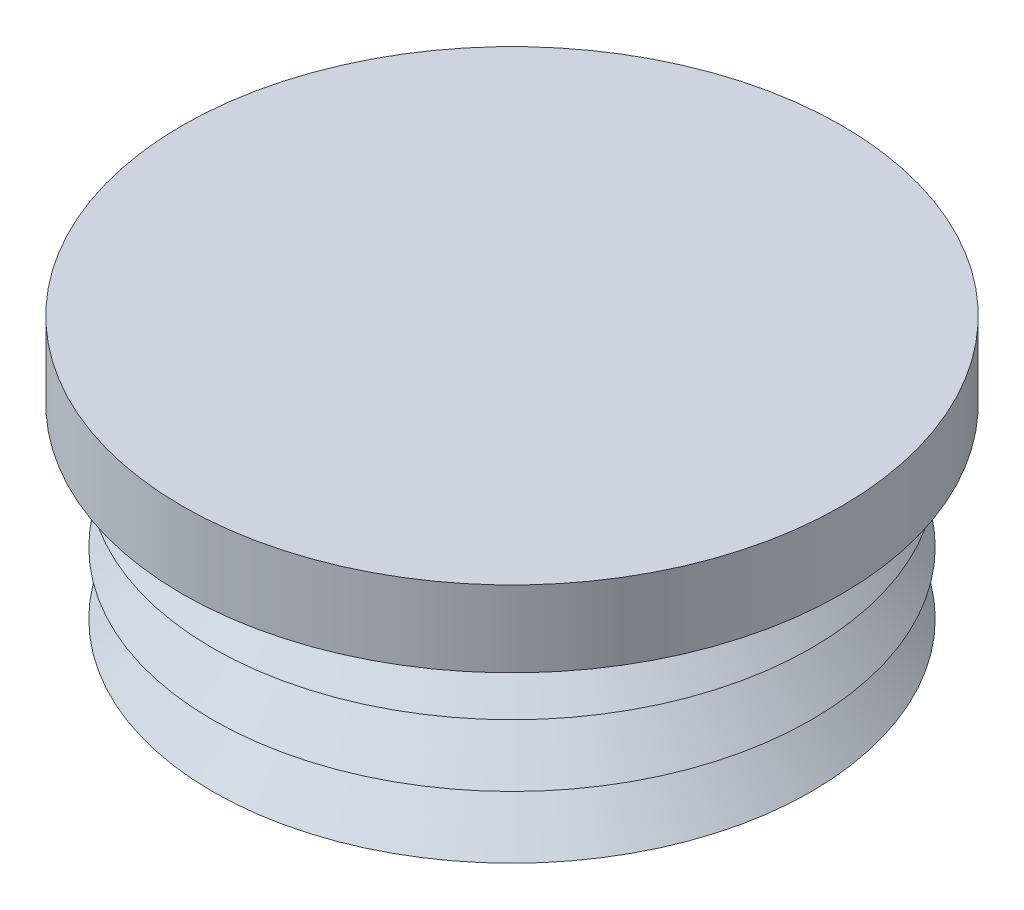
ISO-10303-21;
HEADER;
FILE_DESCRIPTION(('STEP AP214'),'2;1');
FILE_NAME('part.step','',(''),(''),'','','');
FILE_SCHEMA(('AUTOMOTIVE_DESIGN { 1 0 10303 214 1 1 1 1 }'));
ENDSEC;
DATA;
#1=APPLICATION_CONTEXT('core data for automotive mechanical design processes');
#2=APPLICATION_PROTOCOL_DEFINITION('international standard','automotive_design',2000,#1);
#3=PRODUCT_CONTEXT('',#1,'mechanical');
#4=PRODUCT('Part','Part','',(#3));
#5=PRODUCT_RELATED_PRODUCT_CATEGORY('part','',(#4));
#6=PRODUCT_DEFINITION_FORMATION('','',#4);
#7=PRODUCT_DEFINITION_CONTEXT('part definition',#1,'design');
#8=PRODUCT_DEFINITION('design','',#6,#7);
#9=PRODUCT_DEFINITION_SHAPE('','',#8);
#10=(LENGTH_UNIT() NAMED_UNIT(*) SI_UNIT(.MILLI.,.METRE.));
#11=(NAMED_UNIT(*) PLANE_ANGLE_UNIT() SI_UNIT($,.RADIAN.));
#12=(NAMED_UNIT(*) SI_UNIT($,.STERADIAN.) SOLID_ANGLE_UNIT());
#13=UNCERTAINTY_MEASURE_WITH_UNIT(LENGTH_MEASURE(1.E-05),#10,'distance_accuracy_value','');
#14=(GEOMETRIC_REPRESENTATION_CONTEXT(3) GLOBAL_UNCERTAINTY_ASSIGNED_CONTEXT((#13)) GLOBAL_UNIT_ASSIGNED_CONTEXT((#10,
#11,#12)) REPRESENTATION_CONTEXT('',''));
#15=CARTESIAN_POINT('',(0.,0.,0.));
#16=DIRECTION('',(0.,0.,1.));
#17=DIRECTION('',(1.,0.,0.));
#18=AXIS2_PLACEMENT_3D('',#15,#16,#17);
#19=CARTESIAN_POINT('',(0.,12.7,0.));
#20=DIRECTION('',(0.,-1.,0.));
#21=DIRECTION('',(0.,0.,-1.));
#22=AXIS2_PLACEMENT_3D('',#19,#20,#21);
#23=PLANE('',#22);
#24=CARTESIAN_POINT('',(0.,12.7,0.));
#25=DIRECTION('',(0.,-1.,0.));
#26=DIRECTION('',(0.,0.,-1.));
#27=AXIS2_PLACEMENT_3D('',#24,#25,#26);
#28=CIRCLE('',#27,14.9225);
#29=CARTESIAN_POINT('',(0.,12.7,-14.9225));
#30=VERTEX_POINT('',#29);
#31=EDGE_CURVE('E10',#30,#30,#28,.T.);
#32=ORIENTED_EDGE('',*,*,#31,.T.);
#33=EDGE_LOOP('',(#32));
#34=FACE_BOUND('',#33,.T.);
#35=ADVANCED_FACE('F31',(#34),#23,.T.);
#36=CARTESIAN_POINT('',(0.,0.,0.));
#37=DIRECTION('',(0.,-1.,0.));
#38=DIRECTION('',(0.,0.,-1.));
#39=AXIS2_PLACEMENT_3D('',#36,#37,#38);
#40=CYLINDRICAL_SURFACE('',#39,14.9225);
#41=CARTESIAN_POINT('',(0.,0.,0.));
#42=DIRECTION('',(0.,-1.,0.));
#43=DIRECTION('',(0.,0.,-1.));
#44=AXIS2_PLACEMENT_3D('',#41,#42,#43);
#45=CIRCLE('',#44,14.9225);
#46=CARTESIAN_POINT('',(0.,0.,-14.9225));
#47=VERTEX_POINT('',#46);
#48=EDGE_CURVE('E37',#47,#47,#45,.T.);
#49=ORIENTED_EDGE('',*,*,#48,.T.);
#50=EDGE_LOOP('',(#49));
#51=FACE_BOUND('',#50,.T.);
#52=ORIENTED_EDGE('',*,*,#31,.F.);
#53=EDGE_LOOP('',(#52));
#54=FACE_BOUND('',#53,.T.);
#55=ADVANCED_FACE('F96',(#51,#54),#40,.F.);
#56=CARTESIAN_POINT('',(14.9225,0.,0.));
#57=DIRECTION('',(0.,-1.,0.));
#58=DIRECTION('',(0.,0.,-1.));
#59=AXIS2_PLACEMENT_3D('',#56,#57,#58);
#60=PLANE('',#59);
#61=CARTESIAN_POINT('',(0.,0.,0.));
#62=DIRECTION('',(0.,-1.,0.));
#63=DIRECTION('',(0.,0.,-1.));
#64=AXIS2_PLACEMENT_3D('',#61,#62,#63);
#65=CIRCLE('',#64,15.875);
#66=CARTESIAN_POINT('',(0.,0.,-15.875));
#67=VERTEX_POINT('',#66);
#68=EDGE_CURVE('E41',#67,#67,#65,.T.);
#69=ORIENTED_EDGE('',*,*,#68,.T.);
#70=EDGE_LOOP('',(#69));
#71=FACE_BOUND('',#70,.T.);
#72=ORIENTED_EDGE('',*,*,#48,.F.);
#73=EDGE_LOOP('',(#72));
#74=FACE_BOUND('',#73,.T.);
#75=ADVANCED_FACE('F100',(#71,#74),#60,.T.);
#76=CARTESIAN_POINT('',(0.,0.,0.));
#77=DIRECTION('',(0.,-1.,0.));
#78=DIRECTION('',(0.,0.,-1.));
#79=AXIS2_PLACEMENT_3D('',#76,#77,#78);
#80=CYLINDRICAL_SURFACE('',#79,15.875);
#81=CARTESIAN_POINT('',(0.,1.03187500000004,0.));
#82=DIRECTION('',(0.,-1.,0.));
#83=DIRECTION('',(0.,0.,-1.));
#84=AXIS2_PLACEMENT_3D('',#81,#82,#83);
#85=CIRCLE('',#84,15.875);
#86=CARTESIAN_POINT('',(0.,1.03187500000004,-15.875));
#87=VERTEX_POINT('',#86);
#88=EDGE_CURVE('E45',#87,#87,#85,.T.);
#89=ORIENTED_EDGE('',*,*,#88,.T.);
#90=EDGE_LOOP('',(#89));
#91=FACE_BOUND('',#90,.T.);
#92=ORIENTED_EDGE('',*,*,#68,.F.);
#93=EDGE_LOOP('',(#92));
#94=FACE_BOUND('',#93,.T.);
#95=ADVANCED_FACE('F104',(#91,#94),#80,.T.);
#96=CARTESIAN_POINT('',(15.875,1.03187500000004,0.));
#97=DIRECTION('',(0.,-1.,0.));
#98=DIRECTION('',(0.,0.,-1.));
#99=AXIS2_PLACEMENT_3D('',#96,#97,#98);
#100=PLANE('',#99);
#101=CARTESIAN_POINT('',(0.,1.03187500000004,0.));
#102=DIRECTION('',(0.,-1.,0.));
#103=DIRECTION('',(0.,0.,-1.));
#104=AXIS2_PLACEMENT_3D('',#101,#102,#103);
#105=CIRCLE('',#104,18.7325);
#106=CARTESIAN_POINT('',(0.,1.03187500000004,-18.7325));
#107=VERTEX_POINT('',#106);
#108=EDGE_CURVE('E50',#107,#107,#105,.T.);
#109=ORIENTED_EDGE('',*,*,#108,.T.);
#110=EDGE_LOOP('',(#109));
#111=FACE_BOUND('',#110,.T.);
#112=ORIENTED_EDGE('',*,*,#88,.F.);
#113=EDGE_LOOP('',(#112));
#114=FACE_BOUND('',#113,.T.);
#115=ADVANCED_FACE('F111',(#111,#114),#100,.T.);
#116=CARTESIAN_POINT('',(0.,1.03187500000004,0.));
#117=DIRECTION('',(0.,-1.,0.));
#118=DIRECTION('',(0.,0.,-1.));
#119=AXIS2_PLACEMENT_3D('',#116,#117,#118);
#120=CONICAL_SURFACE('',#119,18.7325,0.785398163397457);
#121=CARTESIAN_POINT('',(0.,3.88937499999999,0.));
#122=DIRECTION('',(0.,-1.,0.));
#123=DIRECTION('',(0.,0.,-1.));
#124=AXIS2_PLACEMENT_3D('',#121,#122,#123);
#125=CIRCLE('',#124,15.875);
#126=CARTESIAN_POINT('',(0.,3.88937499999999,-15.875));
#127=VERTEX_POINT('',#126);
#128=EDGE_CURVE('E53',#127,#127,#125,.T.);
#129=ORIENTED_EDGE('',*,*,#128,.T.);
#130=EDGE_LOOP('',(#129));
#131=FACE_BOUND('',#130,.T.);
#132=ORIENTED_EDGE('',*,*,#108,.F.);
#133=EDGE_LOOP('',(#132));
#134=FACE_BOUND('',#133,.T.);
#135=ADVANCED_FACE('F115',(#131,#134),#120,.T.);
#136=CARTESIAN_POINT('',(0.,0.,0.));
#137=DIRECTION('',(0.,-1.,0.));
#138=DIRECTION('',(0.,0.,-1.));
#139=AXIS2_PLACEMENT_3D('',#136,#137,#138);
#140=CYLINDRICAL_SURFACE('',#139,15.875);
#141=CARTESIAN_POINT('',(0.,4.92125000000002,0.));
#142=DIRECTION('',(0.,-1.,0.));
#143=DIRECTION('',(0.,0.,-1.));
#144=AXIS2_PLACEMENT_3D('',#141,#142,#143);
#145=CIRCLE('',#144,15.875);
#146=CARTESIAN_POINT('',(0.,4.92125000000002,-15.875));
#147=VERTEX_POINT('',#146);
#148=EDGE_CURVE('E56',#147,#147,#145,.T.);
#149=ORIENTED_EDGE('',*,*,#148,.T.);
#150=EDGE_LOOP('',(#149));
#151=FACE_BOUND('',#150,.T.);
#152=ORIENTED_EDGE('',*,*,#128,.F.);
#153=EDGE_LOOP('',(#152));
#154=FACE_BOUND('',#153,.T.);
#155=ADVANCED_FACE('F119',(#151,#154),#140,.T.);
#156=CARTESIAN_POINT('',(15.875,4.92125000000002,0.));
#157=DIRECTION('',(0.,-1.,0.));
#158=DIRECTION('',(0.,0.,-1.));
#159=AXIS2_PLACEMENT_3D('',#156,#157,#158);
#160=PLANE('',#159);
#161=CARTESIAN_POINT('',(0.,4.92125000000002,0.));
#162=DIRECTION('',(0.,-1.,0.));
#163=DIRECTION('',(0.,0.,-1.));
#164=AXIS2_PLACEMENT_3D('',#161,#162,#163);
#165=CIRCLE('',#164,18.7325);
#166=CARTESIAN_POINT('',(0.,4.92125000000002,-18.7325));
#167=VERTEX_POINT('',#166);
#168=EDGE_CURVE('E59',#167,#167,#165,.T.);
#169=ORIENTED_EDGE('',*,*,#168,.T.);
#170=EDGE_LOOP('',(#169));
#171=FACE_BOUND('',#170,.T.);
#172=ORIENTED_EDGE('',*,*,#148,.F.);
#173=EDGE_LOOP('',(#172));
#174=FACE_BOUND('',#173,.T.);
#175=ADVANCED_FACE('F123',(#171,#174),#160,.T.);
#176=CARTESIAN_POINT('',(0.,4.92125000000002,0.));
#177=DIRECTION('',(0.,-1.,0.));
#178=DIRECTION('',(0.,0.,-1.));
#179=AXIS2_PLACEMENT_3D('',#176,#177,#178);
#180=CONICAL_SURFACE('',#179,18.7325,0.785398163397457);
#181=CARTESIAN_POINT('',(0.,7.77874999999998,0.));
#182=DIRECTION('',(0.,-1.,0.));
#183=DIRECTION('',(0.,0.,-1.));
#184=AXIS2_PLACEMENT_3D('',#181,#182,#183);
#185=CIRCLE('',#184,15.875);
#186=CARTESIAN_POINT('',(0.,7.77874999999998,-15.875));
#187=VERTEX_POINT('',#186);
#188=EDGE_CURVE('E62',#187,#187,#185,.T.);
#189=ORIENTED_EDGE('',*,*,#188,.T.);
#190=EDGE_LOOP('',(#189));
#191=FACE_BOUND('',#190,.T.);
#192=ORIENTED_EDGE('',*,*,#168,.F.);
#193=EDGE_LOOP('',(#192));
#194=FACE_BOUND('',#193,.T.);
#195=ADVANCED_FACE('F127',(#191,#194),#180,.T.);
#196=CARTESIAN_POINT('',(0.,0.,0.));
#197=DIRECTION('',(0.,-1.,0.));
#198=DIRECTION('',(0.,0.,-1.));
#199=AXIS2_PLACEMENT_3D('',#196,#197,#198);
#200=CYLINDRICAL_SURFACE('',#199,15.875);
#201=CARTESIAN_POINT('',(0.,8.81062500000001,0.));
#202=DIRECTION('',(0.,-1.,0.));
#203=DIRECTION('',(0.,0.,-1.));
#204=AXIS2_PLACEMENT_3D('',#201,#202,#203);
#205=CIRCLE('',#204,15.875);
#206=CARTESIAN_POINT('',(0.,8.81062500000001,-15.875));
#207=VERTEX_POINT('',#206);
#208=EDGE_CURVE('E65',#207,#207,#205,.T.);
#209=ORIENTED_EDGE('',*,*,#208,.T.);
#210=EDGE_LOOP('',(#209));
#211=FACE_BOUND('',#210,.T.);
#212=ORIENTED_EDGE('',*,*,#188,.F.);
#213=EDGE_LOOP('',(#212));
#214=FACE_BOUND('',#213,.T.);
#215=ADVANCED_FACE('F131',(#211,#214),#200,.T.);
#216=CARTESIAN_POINT('',(15.875,8.81062500000001,0.));
#217=DIRECTION('',(0.,-1.,0.));
#218=DIRECTION('',(0.,0.,-1.));
#219=AXIS2_PLACEMENT_3D('',#216,#217,#218);
#220=PLANE('',#219);
#221=CARTESIAN_POINT('',(0.,8.81062500000001,0.));
#222=DIRECTION('',(0.,-1.,0.));
#223=DIRECTION('',(0.,0.,-1.));
#224=AXIS2_PLACEMENT_3D('',#221,#222,#223);
#225=CIRCLE('',#224,18.7325);
#226=CARTESIAN_POINT('',(0.,8.81062500000001,-18.7325));
#227=VERTEX_POINT('',#226);
#228=EDGE_CURVE('E68',#227,#227,#225,.T.);
#229=ORIENTED_EDGE('',*,*,#228,.T.);
#230=EDGE_LOOP('',(#229));
#231=FACE_BOUND('',#230,.T.);
#232=ORIENTED_EDGE('',*,*,#208,.F.);
#233=EDGE_LOOP('',(#232));
#234=FACE_BOUND('',#233,.T.);
#235=ADVANCED_FACE('F135',(#231,#234),#220,.T.);
#236=CARTESIAN_POINT('',(0.,8.81062500000001,0.));
#237=DIRECTION('',(0.,-1.,0.));
#238=DIRECTION('',(0.,0.,-1.));
#239=AXIS2_PLACEMENT_3D('',#236,#237,#238);
#240=CONICAL_SURFACE('',#239,18.7325,0.785398163397457);
#241=CARTESIAN_POINT('',(0.,11.668125,0.));
#242=DIRECTION('',(0.,-1.,0.));
#243=DIRECTION('',(0.,0.,-1.));
#244=AXIS2_PLACEMENT_3D('',#241,#242,#243);
#245=CIRCLE('',#244,15.875);
#246=CARTESIAN_POINT('',(0.,11.668125,-15.875));
#247=VERTEX_POINT('',#246);
#248=EDGE_CURVE('E71',#247,#247,#245,.T.);
#249=ORIENTED_EDGE('',*,*,#248,.T.);
#250=EDGE_LOOP('',(#249));
#251=FACE_BOUND('',#250,.T.);
#252=ORIENTED_EDGE('',*,*,#228,.F.);
#253=EDGE_LOOP('',(#252));
#254=FACE_BOUND('',#253,.T.);
#255=ADVANCED_FACE('F139',(#251,#254),#240,.T.);
#256=CARTESIAN_POINT('',(0.,0.,0.));
#257=DIRECTION('',(0.,-1.,0.));
#258=DIRECTION('',(0.,0.,-1.));
#259=AXIS2_PLACEMENT_3D('',#256,#257,#258);
#260=CYLINDRICAL_SURFACE('',#259,15.875);
#261=CARTESIAN_POINT('',(0.,12.7,0.));
#262=DIRECTION('',(0.,-1.,0.));
#263=DIRECTION('',(0.,0.,-1.));
#264=AXIS2_PLACEMENT_3D('',#261,#262,#263);
#265=CIRCLE('',#264,15.875);
#266=CARTESIAN_POINT('',(0.,12.7,-15.875));
#267=VERTEX_POINT('',#266);
#268=EDGE_CURVE('E74',#267,#267,#265,.T.);
#269=ORIENTED_EDGE('',*,*,#268,.T.);
#270=EDGE_LOOP('',(#269));
#271=FACE_BOUND('',#270,.T.);
#272=ORIENTED_EDGE('',*,*,#248,.F.);
#273=EDGE_LOOP('',(#272));
#274=FACE_BOUND('',#273,.T.);
#275=ADVANCED_FACE('F143',(#271,#274),#260,.T.);
#276=CARTESIAN_POINT('',(15.875,12.7,0.));
#277=DIRECTION('',(0.,-1.,0.));
#278=DIRECTION('',(0.,0.,-1.));
#279=AXIS2_PLACEMENT_3D('',#276,#277,#278);
#280=PLANE('',#279);
#281=CARTESIAN_POINT('',(0.,12.7,0.));
#282=DIRECTION('',(0.,-1.,0.));
#283=DIRECTION('',(0.,0.,-1.));
#284=AXIS2_PLACEMENT_3D('',#281,#282,#283);
#285=CIRCLE('',#284,20.6375);
#286=CARTESIAN_POINT('',(0.,12.7,-20.6375));
#287=VERTEX_POINT('',#286);
#288=EDGE_CURVE('E77',#287,#287,#285,.T.);
#289=ORIENTED_EDGE('',*,*,#288,.T.);
#290=EDGE_LOOP('',(#289));
#291=FACE_BOUND('',#290,.T.);
#292=ORIENTED_EDGE('',*,*,#268,.F.);
#293=EDGE_LOOP('',(#292));
#294=FACE_BOUND('',#293,.T.);
#295=ADVANCED_FACE('F93',(#291,#294),#280,.T.);
#296=CARTESIAN_POINT('',(0.,0.,0.));
#297=DIRECTION('',(0.,-1.,0.));
#298=DIRECTION('',(0.,0.,-1.));
#299=AXIS2_PLACEMENT_3D('',#296,#297,#298);
#300=CYLINDRICAL_SURFACE('',#299,20.6375);
#301=CARTESIAN_POINT('',(0.,17.4625,0.));
#302=DIRECTION('',(0.,-1.,0.));
#303=DIRECTION('',(0.,0.,-1.));
#304=AXIS2_PLACEMENT_3D('',#301,#302,#303);
#305=CIRCLE('',#304,20.6375);
#306=CARTESIAN_POINT('',(0.,17.4625,-20.6375));
#307=VERTEX_POINT('',#306);
#308=EDGE_CURVE('E80',#307,#307,#305,.T.);
#309=ORIENTED_EDGE('',*,*,#308,.T.);
#310=EDGE_LOOP('',(#309));
#311=FACE_BOUND('',#310,.T.);
#312=ORIENTED_EDGE('',*,*,#288,.F.);
#313=EDGE_LOOP('',(#312));
#314=FACE_BOUND('',#313,.T.);
#315=ADVANCED_FACE('F84',(#311,#314),#300,.T.);
#316=CARTESIAN_POINT('',(20.6375,17.4625,0.));
#317=DIRECTION('',(0.,1.,0.));
#318=DIRECTION('',(0.,0.,1.));
#319=AXIS2_PLACEMENT_3D('',#316,#317,#318);
#320=PLANE('',#319);
#321=ORIENTED_EDGE('',*,*,#308,.F.);
#322=EDGE_LOOP('',(#321));
#323=FACE_BOUND('',#322,.T.);
#324=ADVANCED_FACE('F87',(#323),#320,.T.);
#325=CLOSED_SHELL('',(#35,#55,#75,#95,#115,#135,#155,#175,#195,#215,#235,#255,#275,#295,#315,#324));
#326=MANIFOLD_SOLID_BREP('B2',#325);
#327=ADVANCED_BREP_SHAPE_REPRESENTATION('',(#18,#326),#14);
#328=SHAPE_DEFINITION_REPRESENTATION(#9,#327);
ENDSEC;
END-ISO-10303-21;
